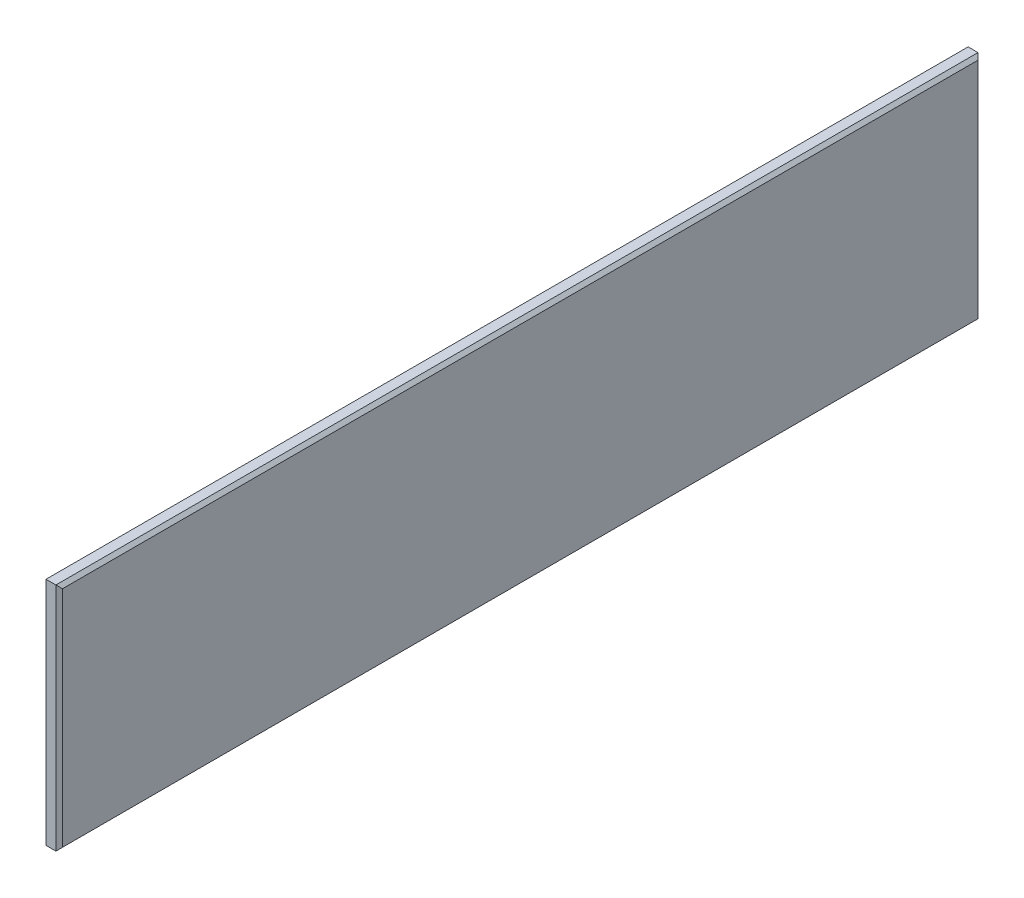
ISO-10303-21;
HEADER;
FILE_DESCRIPTION(('STEP AP214'),'2;1');
FILE_NAME('part.step','',(''),(''),'','','');
FILE_SCHEMA(('AUTOMOTIVE_DESIGN { 1 0 10303 214 1 1 1 1 }'));
ENDSEC;
DATA;
#1=APPLICATION_CONTEXT('core data for automotive mechanical design processes');
#2=APPLICATION_PROTOCOL_DEFINITION('international standard','automotive_design',2000,#1);
#3=PRODUCT_CONTEXT('',#1,'mechanical');
#4=PRODUCT('Part','Part','',(#3));
#5=PRODUCT_RELATED_PRODUCT_CATEGORY('part','',(#4));
#6=PRODUCT_DEFINITION_FORMATION('','',#4);
#7=PRODUCT_DEFINITION_CONTEXT('part definition',#1,'design');
#8=PRODUCT_DEFINITION('design','',#6,#7);
#9=PRODUCT_DEFINITION_SHAPE('','',#8);
#10=(LENGTH_UNIT() NAMED_UNIT(*) SI_UNIT(.MILLI.,.METRE.));
#11=(NAMED_UNIT(*) PLANE_ANGLE_UNIT() SI_UNIT($,.RADIAN.));
#12=(NAMED_UNIT(*) SI_UNIT($,.STERADIAN.) SOLID_ANGLE_UNIT());
#13=UNCERTAINTY_MEASURE_WITH_UNIT(LENGTH_MEASURE(1.E-05),#10,'distance_accuracy_value','');
#14=(GEOMETRIC_REPRESENTATION_CONTEXT(3) GLOBAL_UNCERTAINTY_ASSIGNED_CONTEXT((#13)) GLOBAL_UNIT_ASSIGNED_CONTEXT((#10,
#11,#12)) REPRESENTATION_CONTEXT('',''));
#15=CARTESIAN_POINT('',(0.,0.,0.));
#16=DIRECTION('',(0.,0.,1.));
#17=DIRECTION('',(1.,0.,0.));
#18=AXIS2_PLACEMENT_3D('',#15,#16,#17);
#19=CARTESIAN_POINT('',(0.,70.,0.));
#20=DIRECTION('',(1.,0.,0.));
#21=DIRECTION('',(0.,0.,-1.));
#22=AXIS2_PLACEMENT_3D('',#19,#20,#21);
#23=PLANE('',#22);
#24=DIRECTION('',(0.,0.,-1.));
#25=VECTOR('',#24,1.);
#26=CARTESIAN_POINT('',(0.,69.,0.));
#27=LINE('',#26,#25);
#28=CARTESIAN_POINT('',(0.,69.,-1.));
#29=VERTEX_POINT('',#28);
#30=CARTESIAN_POINT('',(0.,69.,-279.));
#31=VERTEX_POINT('',#30);
#32=EDGE_CURVE('E124',#29,#31,#27,.T.);
#33=ORIENTED_EDGE('',*,*,#32,.T.);
#34=DIRECTION('',(0.,-1.,0.));
#35=VECTOR('',#34,1.);
#36=CARTESIAN_POINT('',(0.,70.,-279.));
#37=LINE('',#36,#35);
#38=CARTESIAN_POINT('',(0.,1.,-279.));
#39=VERTEX_POINT('',#38);
#40=EDGE_CURVE('E106',#31,#39,#37,.T.);
#41=ORIENTED_EDGE('',*,*,#40,.T.);
#42=DIRECTION('',(0.,0.,1.));
#43=VECTOR('',#42,1.);
#44=CARTESIAN_POINT('',(0.,1.,0.));
#45=LINE('',#44,#43);
#46=CARTESIAN_POINT('',(0.,1.,-1.));
#47=VERTEX_POINT('',#46);
#48=EDGE_CURVE('E114',#39,#47,#45,.T.);
#49=ORIENTED_EDGE('',*,*,#48,.T.);
#50=DIRECTION('',(0.,1.,0.));
#51=VECTOR('',#50,1.);
#52=CARTESIAN_POINT('',(0.,70.,-1.));
#53=LINE('',#52,#51);
#54=EDGE_CURVE('E120',#47,#29,#53,.T.);
#55=ORIENTED_EDGE('',*,*,#54,.T.);
#56=EDGE_LOOP('',(#33,#41,#49,#55));
#57=FACE_BOUND('',#56,.T.);
#58=ADVANCED_FACE('F35',(#57),#23,.F.);
#59=CARTESIAN_POINT('',(0.,70.,0.));
#60=DIRECTION('',(0.,0.,-1.));
#61=DIRECTION('',(-1.,0.,0.));
#62=AXIS2_PLACEMENT_3D('',#59,#60,#61);
#63=PLANE('',#62);
#64=DIRECTION('',(1.,0.,0.));
#65=VECTOR('',#64,1.);
#66=CARTESIAN_POINT('',(0.,70.,0.));
#67=LINE('',#66,#65);
#68=CARTESIAN_POINT('',(1.,70.,0.));
#69=VERTEX_POINT('',#68);
#70=CARTESIAN_POINT('',(4.,70.,0.));
#71=VERTEX_POINT('',#70);
#72=EDGE_CURVE('E182',#69,#71,#67,.T.);
#73=ORIENTED_EDGE('',*,*,#72,.F.);
#74=DIRECTION('',(0.,-1.,0.));
#75=VECTOR('',#74,1.);
#76=CARTESIAN_POINT('',(1.,70.,0.));
#77=LINE('',#76,#75);
#78=CARTESIAN_POINT('',(1.,0.,0.));
#79=VERTEX_POINT('',#78);
#80=EDGE_CURVE('E140',#69,#79,#77,.T.);
#81=ORIENTED_EDGE('',*,*,#80,.T.);
#82=DIRECTION('',(1.,0.,0.));
#83=VECTOR('',#82,1.);
#84=CARTESIAN_POINT('',(0.,0.,0.));
#85=LINE('',#84,#83);
#86=CARTESIAN_POINT('',(4.,0.,0.));
#87=VERTEX_POINT('',#86);
#88=EDGE_CURVE('E155',#79,#87,#85,.T.);
#89=ORIENTED_EDGE('',*,*,#88,.T.);
#90=DIRECTION('',(0.,1.,0.));
#91=VECTOR('',#90,1.);
#92=CARTESIAN_POINT('',(4.,70.,0.));
#93=LINE('',#92,#91);
#94=EDGE_CURVE('E137',#87,#71,#93,.T.);
#95=ORIENTED_EDGE('',*,*,#94,.T.);
#96=EDGE_LOOP('',(#73,#81,#89,#95));
#97=FACE_BOUND('',#96,.T.);
#98=ADVANCED_FACE('F199',(#97),#63,.F.);
#99=CARTESIAN_POINT('',(5.,70.,0.));
#100=DIRECTION('',(-1.,0.,0.));
#101=DIRECTION('',(0.,0.,1.));
#102=AXIS2_PLACEMENT_3D('',#99,#100,#101);
#103=PLANE('',#102);
#104=DIRECTION('',(0.,0.,1.));
#105=VECTOR('',#104,1.);
#106=CARTESIAN_POINT('',(5.,69.,0.));
#107=LINE('',#106,#105);
#108=CARTESIAN_POINT('',(5.,69.,-279.));
#109=VERTEX_POINT('',#108);
#110=CARTESIAN_POINT('',(5.,69.,-1.));
#111=VERTEX_POINT('',#110);
#112=EDGE_CURVE('E45',#109,#111,#107,.T.);
#113=ORIENTED_EDGE('',*,*,#112,.T.);
#114=DIRECTION('',(0.,-1.,0.));
#115=VECTOR('',#114,1.);
#116=CARTESIAN_POINT('',(5.,70.,-1.));
#117=LINE('',#116,#115);
#118=CARTESIAN_POINT('',(5.,1.,-1.));
#119=VERTEX_POINT('',#118);
#120=EDGE_CURVE('E11',#111,#119,#117,.T.);
#121=ORIENTED_EDGE('',*,*,#120,.T.);
#122=DIRECTION('',(0.,0.,-1.));
#123=VECTOR('',#122,1.);
#124=CARTESIAN_POINT('',(5.,1.,-280.));
#125=LINE('',#124,#123);
#126=CARTESIAN_POINT('',(5.,1.,-279.));
#127=VERTEX_POINT('',#126);
#128=EDGE_CURVE('E146',#119,#127,#125,.T.);
#129=ORIENTED_EDGE('',*,*,#128,.T.);
#130=DIRECTION('',(0.,1.,0.));
#131=VECTOR('',#130,1.);
#132=CARTESIAN_POINT('',(5.,70.,-279.));
#133=LINE('',#132,#131);
#134=EDGE_CURVE('E56',#127,#109,#133,.T.);
#135=ORIENTED_EDGE('',*,*,#134,.T.);
#136=EDGE_LOOP('',(#113,#121,#129,#135));
#137=FACE_BOUND('',#136,.T.);
#138=ADVANCED_FACE('F206',(#137),#103,.F.);
#139=CARTESIAN_POINT('',(0.,70.,-280.));
#140=DIRECTION('',(0.,0.,1.));
#141=DIRECTION('',(1.,0.,0.));
#142=AXIS2_PLACEMENT_3D('',#139,#140,#141);
#143=PLANE('',#142);
#144=DIRECTION('',(-1.,0.,0.));
#145=VECTOR('',#144,1.);
#146=CARTESIAN_POINT('',(0.,0.,-280.));
#147=LINE('',#146,#145);
#148=CARTESIAN_POINT('',(4.,0.,-280.));
#149=VERTEX_POINT('',#148);
#150=CARTESIAN_POINT('',(1.,0.,-280.));
#151=VERTEX_POINT('',#150);
#152=EDGE_CURVE('E176',#149,#151,#147,.T.);
#153=ORIENTED_EDGE('',*,*,#152,.T.);
#154=DIRECTION('',(0.,1.,0.));
#155=VECTOR('',#154,1.);
#156=CARTESIAN_POINT('',(1.,70.,-280.));
#157=LINE('',#156,#155);
#158=CARTESIAN_POINT('',(1.,70.,-280.));
#159=VERTEX_POINT('',#158);
#160=EDGE_CURVE('E108',#151,#159,#157,.T.);
#161=ORIENTED_EDGE('',*,*,#160,.T.);
#162=DIRECTION('',(-1.,0.,0.));
#163=VECTOR('',#162,1.);
#164=CARTESIAN_POINT('',(0.,70.,-280.));
#165=LINE('',#164,#163);
#166=CARTESIAN_POINT('',(4.,70.,-280.));
#167=VERTEX_POINT('',#166);
#168=EDGE_CURVE('E121',#167,#159,#165,.T.);
#169=ORIENTED_EDGE('',*,*,#168,.F.);
#170=DIRECTION('',(0.,-1.,0.));
#171=VECTOR('',#170,1.);
#172=CARTESIAN_POINT('',(4.,70.,-280.));
#173=LINE('',#172,#171);
#174=EDGE_CURVE('E126',#167,#149,#173,.T.);
#175=ORIENTED_EDGE('',*,*,#174,.T.);
#176=EDGE_LOOP('',(#153,#161,#169,#175));
#177=FACE_BOUND('',#176,.T.);
#178=ADVANCED_FACE('F175',(#177),#143,.F.);
#179=CARTESIAN_POINT('',(0.,70.,0.));
#180=DIRECTION('',(0.,-1.,0.));
#181=DIRECTION('',(0.,0.,-1.));
#182=AXIS2_PLACEMENT_3D('',#179,#180,#181);
#183=PLANE('',#182);
#184=ORIENTED_EDGE('',*,*,#168,.T.);
#185=DIRECTION('',(0.,0.,1.));
#186=VECTOR('',#185,1.);
#187=CARTESIAN_POINT('',(1.,70.,0.));
#188=LINE('',#187,#186);
#189=EDGE_CURVE('E135',#159,#69,#188,.T.);
#190=ORIENTED_EDGE('',*,*,#189,.T.);
#191=ORIENTED_EDGE('',*,*,#72,.T.);
#192=DIRECTION('',(0.,0.,-1.));
#193=VECTOR('',#192,1.);
#194=CARTESIAN_POINT('',(4.,70.,0.));
#195=LINE('',#194,#193);
#196=EDGE_CURVE('E133',#71,#167,#195,.T.);
#197=ORIENTED_EDGE('',*,*,#196,.T.);
#198=EDGE_LOOP('',(#184,#190,#191,#197));
#199=FACE_BOUND('',#198,.T.);
#200=ADVANCED_FACE('F197',(#199),#183,.F.);
#201=CARTESIAN_POINT('',(0.,0.,0.));
#202=DIRECTION('',(0.,-1.,0.));
#203=DIRECTION('',(0.,0.,-1.));
#204=AXIS2_PLACEMENT_3D('',#201,#202,#203);
#205=PLANE('',#204);
#206=ORIENTED_EDGE('',*,*,#88,.F.);
#207=DIRECTION('',(0.,0.,-1.));
#208=VECTOR('',#207,1.);
#209=CARTESIAN_POINT('',(1.,0.,-280.));
#210=LINE('',#209,#208);
#211=EDGE_CURVE('E144',#79,#151,#210,.T.);
#212=ORIENTED_EDGE('',*,*,#211,.T.);
#213=ORIENTED_EDGE('',*,*,#152,.F.);
#214=DIRECTION('',(0.,0.,1.));
#215=VECTOR('',#214,1.);
#216=CARTESIAN_POINT('',(4.,0.,0.));
#217=LINE('',#216,#215);
#218=EDGE_CURVE('E142',#149,#87,#217,.T.);
#219=ORIENTED_EDGE('',*,*,#218,.T.);
#220=EDGE_LOOP('',(#206,#212,#213,#219));
#221=FACE_BOUND('',#220,.T.);
#222=ADVANCED_FACE('F180',(#221),#205,.T.);
#223=CARTESIAN_POINT('',(1.,70.,0.));
#224=DIRECTION('',(0.707106781186547,0.,-0.707106781186547));
#225=DIRECTION('',(0.,-1.,0.));
#226=AXIS2_PLACEMENT_3D('',#223,#224,#225);
#227=PLANE('',#226);
#228=DIRECTION('',(0.577350269189626,-0.577350269189626,0.577350269189626));
#229=VECTOR('',#228,1.);
#230=CARTESIAN_POINT('',(0.333333333333334,0.666666666666667,-0.666666666666667));
#231=LINE('',#230,#229);
#232=EDGE_CURVE('E117',#79,#47,#231,.F.);
#233=ORIENTED_EDGE('',*,*,#232,.F.);
#234=ORIENTED_EDGE('',*,*,#80,.F.);
#235=DIRECTION('',(-0.577350269189626,-0.577350269189626,-0.577350269189626));
#236=VECTOR('',#235,1.);
#237=CARTESIAN_POINT('',(1.,70.,0.));
#238=LINE('',#237,#236);
#239=EDGE_CURVE('E152',#29,#69,#238,.F.);
#240=ORIENTED_EDGE('',*,*,#239,.F.);
#241=ORIENTED_EDGE('',*,*,#54,.F.);
#242=EDGE_LOOP('',(#233,#234,#240,#241));
#243=FACE_BOUND('',#242,.T.);
#244=ADVANCED_FACE('F191',(#243),#227,.F.);
#245=CARTESIAN_POINT('',(1.,70.,0.));
#246=DIRECTION('',(0.707106781186547,-0.707106781186547,0.));
#247=DIRECTION('',(0.,0.,1.));
#248=AXIS2_PLACEMENT_3D('',#245,#246,#247);
#249=PLANE('',#248);
#250=ORIENTED_EDGE('',*,*,#239,.T.);
#251=ORIENTED_EDGE('',*,*,#189,.F.);
#252=DIRECTION('',(-0.577350269189626,-0.577350269189626,0.577350269189626));
#253=VECTOR('',#252,1.);
#254=CARTESIAN_POINT('',(-92.3333333333334,-23.3333333333333,-186.666666666667));
#255=LINE('',#254,#253);
#256=EDGE_CURVE('E111',#31,#159,#255,.F.);
#257=ORIENTED_EDGE('',*,*,#256,.F.);
#258=ORIENTED_EDGE('',*,*,#32,.F.);
#259=EDGE_LOOP('',(#250,#251,#257,#258));
#260=FACE_BOUND('',#259,.T.);
#261=ADVANCED_FACE('F194',(#260),#249,.F.);
#262=CARTESIAN_POINT('',(0.,1.,0.));
#263=DIRECTION('',(-0.707106781186547,-0.707106781186547,0.));
#264=DIRECTION('',(0.,0.,-1.));
#265=AXIS2_PLACEMENT_3D('',#262,#263,#264);
#266=PLANE('',#265);
#267=ORIENTED_EDGE('',*,*,#232,.T.);
#268=ORIENTED_EDGE('',*,*,#48,.F.);
#269=DIRECTION('',(-0.577350269189626,0.577350269189626,0.577350269189626));
#270=VECTOR('',#269,1.);
#271=CARTESIAN_POINT('',(-93.,94.,-186.));
#272=LINE('',#271,#270);
#273=EDGE_CURVE('E102',#151,#39,#272,.T.);
#274=ORIENTED_EDGE('',*,*,#273,.F.);
#275=ORIENTED_EDGE('',*,*,#211,.F.);
#276=EDGE_LOOP('',(#267,#268,#274,#275));
#277=FACE_BOUND('',#276,.T.);
#278=ADVANCED_FACE('F115',(#277),#266,.T.);
#279=CARTESIAN_POINT('',(0.,70.,-279.));
#280=DIRECTION('',(0.707106781186547,0.,0.707106781186547));
#281=DIRECTION('',(0.,-1.,0.));
#282=AXIS2_PLACEMENT_3D('',#279,#280,#281);
#283=PLANE('',#282);
#284=ORIENTED_EDGE('',*,*,#256,.T.);
#285=ORIENTED_EDGE('',*,*,#160,.F.);
#286=ORIENTED_EDGE('',*,*,#273,.T.);
#287=ORIENTED_EDGE('',*,*,#40,.F.);
#288=EDGE_LOOP('',(#284,#285,#286,#287));
#289=FACE_BOUND('',#288,.T.);
#290=ADVANCED_FACE('F104',(#289),#283,.F.);
#291=CARTESIAN_POINT('',(4.,70.,-280.));
#292=DIRECTION('',(-0.707106781186547,0.,0.707106781186547));
#293=DIRECTION('',(0.,-1.,0.));
#294=AXIS2_PLACEMENT_3D('',#291,#292,#293);
#295=PLANE('',#294);
#296=DIRECTION('',(-0.577350269189626,-0.577350269189626,-0.577350269189626));
#297=VECTOR('',#296,1.);
#298=CARTESIAN_POINT('',(98.,94.,-186.));
#299=LINE('',#298,#297);
#300=EDGE_CURVE('E159',#149,#127,#299,.F.);
#301=ORIENTED_EDGE('',*,*,#300,.F.);
#302=ORIENTED_EDGE('',*,*,#174,.F.);
#303=DIRECTION('',(0.577350269189626,-0.577350269189626,0.577350269189626));
#304=VECTOR('',#303,1.);
#305=CARTESIAN_POINT('',(4.,70.,-280.));
#306=LINE('',#305,#304);
#307=EDGE_CURVE('E40',#109,#167,#306,.F.);
#308=ORIENTED_EDGE('',*,*,#307,.F.);
#309=ORIENTED_EDGE('',*,*,#134,.F.);
#310=EDGE_LOOP('',(#301,#302,#308,#309));
#311=FACE_BOUND('',#310,.T.);
#312=ADVANCED_FACE('F38',(#311),#295,.F.);
#313=CARTESIAN_POINT('',(4.,70.,0.));
#314=DIRECTION('',(-0.707106781186547,-0.707106781186547,0.));
#315=DIRECTION('',(0.,0.,-1.));
#316=AXIS2_PLACEMENT_3D('',#313,#314,#315);
#317=PLANE('',#316);
#318=ORIENTED_EDGE('',*,*,#307,.T.);
#319=ORIENTED_EDGE('',*,*,#196,.F.);
#320=DIRECTION('',(0.577350269189626,-0.577350269189626,-0.577350269189626));
#321=VECTOR('',#320,1.);
#322=CARTESIAN_POINT('',(4.,70.,0.));
#323=LINE('',#322,#321);
#324=EDGE_CURVE('E158',#111,#71,#323,.F.);
#325=ORIENTED_EDGE('',*,*,#324,.F.);
#326=ORIENTED_EDGE('',*,*,#112,.F.);
#327=EDGE_LOOP('',(#318,#319,#325,#326));
#328=FACE_BOUND('',#327,.T.);
#329=ADVANCED_FACE('F168',(#328),#317,.F.);
#330=CARTESIAN_POINT('',(5.,1.,0.));
#331=DIRECTION('',(0.707106781186547,-0.707106781186547,0.));
#332=DIRECTION('',(0.,0.,1.));
#333=AXIS2_PLACEMENT_3D('',#330,#331,#332);
#334=PLANE('',#333);
#335=ORIENTED_EDGE('',*,*,#300,.T.);
#336=ORIENTED_EDGE('',*,*,#128,.F.);
#337=DIRECTION('',(0.577350269189626,0.577350269189626,-0.577350269189626));
#338=VECTOR('',#337,1.);
#339=CARTESIAN_POINT('',(4.66666666666666,0.666666666666667,-0.666666666666667));
#340=LINE('',#339,#338);
#341=EDGE_CURVE('E156',#87,#119,#340,.T.);
#342=ORIENTED_EDGE('',*,*,#341,.F.);
#343=ORIENTED_EDGE('',*,*,#218,.F.);
#344=EDGE_LOOP('',(#335,#336,#342,#343));
#345=FACE_BOUND('',#344,.T.);
#346=ADVANCED_FACE('F205',(#345),#334,.T.);
#347=CARTESIAN_POINT('',(5.,70.,-1.));
#348=DIRECTION('',(-0.707106781186547,0.,-0.707106781186547));
#349=DIRECTION('',(0.,-1.,0.));
#350=AXIS2_PLACEMENT_3D('',#347,#348,#349);
#351=PLANE('',#350);
#352=ORIENTED_EDGE('',*,*,#324,.T.);
#353=ORIENTED_EDGE('',*,*,#94,.F.);
#354=ORIENTED_EDGE('',*,*,#341,.T.);
#355=ORIENTED_EDGE('',*,*,#120,.F.);
#356=EDGE_LOOP('',(#352,#353,#354,#355));
#357=FACE_BOUND('',#356,.T.);
#358=ADVANCED_FACE('F203',(#357),#351,.F.);
#359=CLOSED_SHELL('',(#58,#98,#138,#178,#200,#222,#244,#261,#278,#290,#312,#329,#346,#358));
#360=MANIFOLD_SOLID_BREP('B2',#359);
#361=ADVANCED_BREP_SHAPE_REPRESENTATION('',(#18,#360),#14);
#362=SHAPE_DEFINITION_REPRESENTATION(#9,#361);
ENDSEC;
END-ISO-10303-21;
